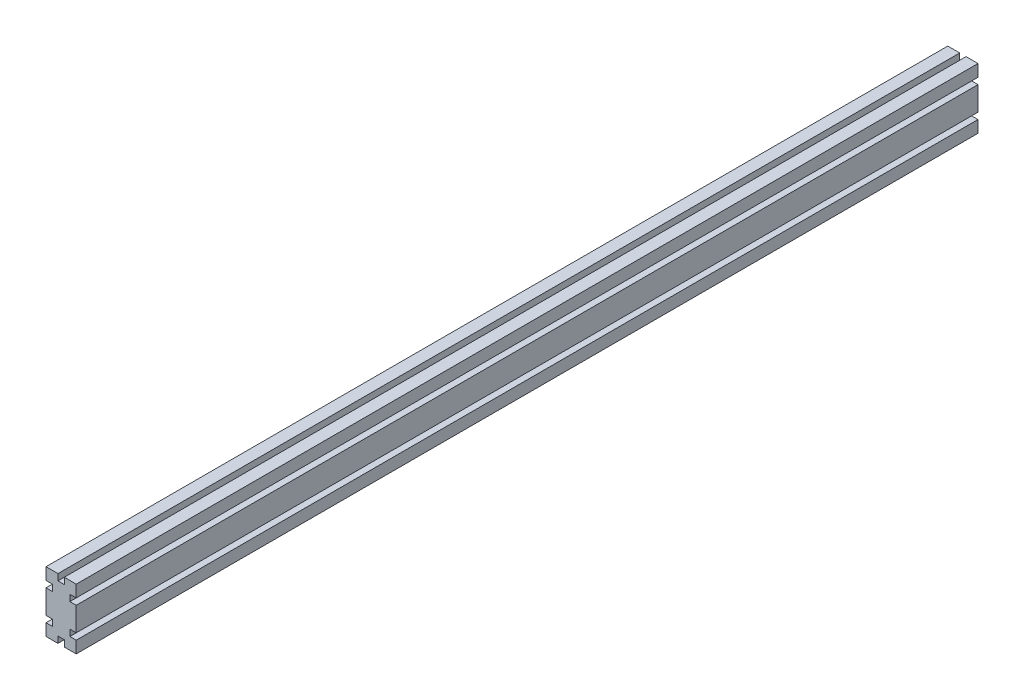
ISO-10303-21;
HEADER;
FILE_DESCRIPTION(('STEP AP214'),'2;1');
FILE_NAME('part.step','',(''),(''),'','','');
FILE_SCHEMA(('AUTOMOTIVE_DESIGN { 1 0 10303 214 1 1 1 1 }'));
ENDSEC;
DATA;
#1=APPLICATION_CONTEXT('core data for automotive mechanical design processes');
#2=APPLICATION_PROTOCOL_DEFINITION('international standard','automotive_design',2000,#1);
#3=PRODUCT_CONTEXT('',#1,'mechanical');
#4=PRODUCT('Part','Part','',(#3));
#5=PRODUCT_RELATED_PRODUCT_CATEGORY('part','',(#4));
#6=PRODUCT_DEFINITION_FORMATION('','',#4);
#7=PRODUCT_DEFINITION_CONTEXT('part definition',#1,'design');
#8=PRODUCT_DEFINITION('design','',#6,#7);
#9=PRODUCT_DEFINITION_SHAPE('','',#8);
#10=(LENGTH_UNIT() NAMED_UNIT(*) SI_UNIT(.MILLI.,.METRE.));
#11=(NAMED_UNIT(*) PLANE_ANGLE_UNIT() SI_UNIT($,.RADIAN.));
#12=(NAMED_UNIT(*) SI_UNIT($,.STERADIAN.) SOLID_ANGLE_UNIT());
#13=UNCERTAINTY_MEASURE_WITH_UNIT(LENGTH_MEASURE(1.E-05),#10,'distance_accuracy_value','');
#14=(GEOMETRIC_REPRESENTATION_CONTEXT(3) GLOBAL_UNCERTAINTY_ASSIGNED_CONTEXT((#13)) GLOBAL_UNIT_ASSIGNED_CONTEXT((#10,
#11,#12)) REPRESENTATION_CONTEXT('',''));
#15=CARTESIAN_POINT('',(0.,0.,0.));
#16=DIRECTION('',(0.,0.,1.));
#17=DIRECTION('',(1.,0.,0.));
#18=AXIS2_PLACEMENT_3D('',#15,#16,#17);
#19=CARTESIAN_POINT('',(-19.05,-23.05,1136.65));
#20=DIRECTION('',(1.,0.,0.));
#21=DIRECTION('',(0.,0.,-1.));
#22=AXIS2_PLACEMENT_3D('',#19,#20,#21);
#23=PLANE('',#22);
#24=DIRECTION('',(0.,-1.,0.));
#25=VECTOR('',#24,1.);
#26=CARTESIAN_POINT('',(-19.05,-23.05,0.));
#27=LINE('',#26,#25);
#28=CARTESIAN_POINT('',(-19.05,-23.05,0.));
#29=VERTEX_POINT('',#28);
#30=CARTESIAN_POINT('',(-19.05,-38.1,0.));
#31=VERTEX_POINT('',#30);
#32=EDGE_CURVE('E255',#29,#31,#27,.T.);
#33=ORIENTED_EDGE('',*,*,#32,.T.);
#34=DIRECTION('',(0.,0.,-1.));
#35=VECTOR('',#34,1.);
#36=CARTESIAN_POINT('',(-19.05,-38.1,1136.65));
#37=LINE('',#36,#35);
#38=CARTESIAN_POINT('',(-19.05,-38.1,1136.65));
#39=VERTEX_POINT('',#38);
#40=EDGE_CURVE('E11',#39,#31,#37,.T.);
#41=ORIENTED_EDGE('',*,*,#40,.F.);
#42=DIRECTION('',(0.,-1.,0.));
#43=VECTOR('',#42,1.);
#44=CARTESIAN_POINT('',(-19.05,-23.05,1136.65));
#45=LINE('',#44,#43);
#46=CARTESIAN_POINT('',(-19.05,-23.05,1136.65));
#47=VERTEX_POINT('',#46);
#48=EDGE_CURVE('E309',#47,#39,#45,.T.);
#49=ORIENTED_EDGE('',*,*,#48,.F.);
#50=DIRECTION('',(0.,0.,-1.));
#51=VECTOR('',#50,1.);
#52=CARTESIAN_POINT('',(-19.05,-23.05,1136.65));
#53=LINE('',#52,#51);
#54=EDGE_CURVE('E251',#47,#29,#53,.T.);
#55=ORIENTED_EDGE('',*,*,#54,.T.);
#56=EDGE_LOOP('',(#33,#41,#49,#55));
#57=FACE_BOUND('',#56,.T.);
#58=ADVANCED_FACE('F39',(#57),#23,.F.);
#59=CARTESIAN_POINT('',(-19.05,-38.1,1136.65));
#60=DIRECTION('',(0.,1.,0.));
#61=DIRECTION('',(0.,0.,1.));
#62=AXIS2_PLACEMENT_3D('',#59,#60,#61);
#63=PLANE('',#62);
#64=DIRECTION('',(1.,0.,0.));
#65=VECTOR('',#64,1.);
#66=CARTESIAN_POINT('',(-19.05,-38.1,0.));
#67=LINE('',#66,#65);
#68=CARTESIAN_POINT('',(-4.,-38.1,0.));
#69=VERTEX_POINT('',#68);
#70=EDGE_CURVE('E258',#31,#69,#67,.T.);
#71=ORIENTED_EDGE('',*,*,#70,.T.);
#72=DIRECTION('',(0.,0.,-1.));
#73=VECTOR('',#72,1.);
#74=CARTESIAN_POINT('',(-4.,-38.1,1136.65));
#75=LINE('',#74,#73);
#76=CARTESIAN_POINT('',(-4.,-38.1,1136.65));
#77=VERTEX_POINT('',#76);
#78=EDGE_CURVE('E47',#77,#69,#75,.T.);
#79=ORIENTED_EDGE('',*,*,#78,.F.);
#80=DIRECTION('',(1.,0.,0.));
#81=VECTOR('',#80,1.);
#82=CARTESIAN_POINT('',(-19.05,-38.1,1136.65));
#83=LINE('',#82,#81);
#84=EDGE_CURVE('E158',#39,#77,#83,.T.);
#85=ORIENTED_EDGE('',*,*,#84,.F.);
#86=ORIENTED_EDGE('',*,*,#40,.T.);
#87=EDGE_LOOP('',(#71,#79,#85,#86));
#88=FACE_BOUND('',#87,.T.);
#89=ADVANCED_FACE('F467',(#88),#63,.F.);
#90=CARTESIAN_POINT('',(-4.,-38.1,1136.65));
#91=DIRECTION('',(-1.,0.,0.));
#92=DIRECTION('',(0.,0.,1.));
#93=AXIS2_PLACEMENT_3D('',#90,#91,#92);
#94=PLANE('',#93);
#95=DIRECTION('',(0.,1.,0.));
#96=VECTOR('',#95,1.);
#97=CARTESIAN_POINT('',(-4.,-38.1,0.));
#98=LINE('',#97,#96);
#99=CARTESIAN_POINT('',(-4.,-30.1,0.));
#100=VERTEX_POINT('',#99);
#101=EDGE_CURVE('E260',#69,#100,#98,.T.);
#102=ORIENTED_EDGE('',*,*,#101,.T.);
#103=DIRECTION('',(0.,0.,-1.));
#104=VECTOR('',#103,1.);
#105=CARTESIAN_POINT('',(-4.,-30.1,1136.65));
#106=LINE('',#105,#104);
#107=CARTESIAN_POINT('',(-4.,-30.1,1136.65));
#108=VERTEX_POINT('',#107);
#109=EDGE_CURVE('E376',#108,#100,#106,.T.);
#110=ORIENTED_EDGE('',*,*,#109,.F.);
#111=DIRECTION('',(0.,1.,0.));
#112=VECTOR('',#111,1.);
#113=CARTESIAN_POINT('',(-4.,-38.1,1136.65));
#114=LINE('',#113,#112);
#115=EDGE_CURVE('E384',#77,#108,#114,.T.);
#116=ORIENTED_EDGE('',*,*,#115,.F.);
#117=ORIENTED_EDGE('',*,*,#78,.T.);
#118=EDGE_LOOP('',(#102,#110,#116,#117));
#119=FACE_BOUND('',#118,.T.);
#120=ADVANCED_FACE('F382',(#119),#94,.F.);
#121=CARTESIAN_POINT('',(-4.,-30.1,1136.65));
#122=DIRECTION('',(0.,1.,0.));
#123=DIRECTION('',(0.,0.,1.));
#124=AXIS2_PLACEMENT_3D('',#121,#122,#123);
#125=PLANE('',#124);
#126=DIRECTION('',(1.,0.,0.));
#127=VECTOR('',#126,1.);
#128=CARTESIAN_POINT('',(-4.,-30.1,0.));
#129=LINE('',#128,#127);
#130=CARTESIAN_POINT('',(4.,-30.1,0.));
#131=VERTEX_POINT('',#130);
#132=EDGE_CURVE('E262',#100,#131,#129,.T.);
#133=ORIENTED_EDGE('',*,*,#132,.T.);
#134=DIRECTION('',(0.,0.,-1.));
#135=VECTOR('',#134,1.);
#136=CARTESIAN_POINT('',(4.,-30.1,1136.65));
#137=LINE('',#136,#135);
#138=CARTESIAN_POINT('',(4.,-30.1,1136.65));
#139=VERTEX_POINT('',#138);
#140=EDGE_CURVE('E373',#139,#131,#137,.T.);
#141=ORIENTED_EDGE('',*,*,#140,.F.);
#142=DIRECTION('',(1.,0.,0.));
#143=VECTOR('',#142,1.);
#144=CARTESIAN_POINT('',(-4.,-30.1,1136.65));
#145=LINE('',#144,#143);
#146=EDGE_CURVE('E402',#108,#139,#145,.T.);
#147=ORIENTED_EDGE('',*,*,#146,.F.);
#148=ORIENTED_EDGE('',*,*,#109,.T.);
#149=EDGE_LOOP('',(#133,#141,#147,#148));
#150=FACE_BOUND('',#149,.T.);
#151=ADVANCED_FACE('F393',(#150),#125,.F.);
#152=CARTESIAN_POINT('',(4.,-30.1,1136.65));
#153=DIRECTION('',(1.,0.,0.));
#154=DIRECTION('',(0.,0.,-1.));
#155=AXIS2_PLACEMENT_3D('',#152,#153,#154);
#156=PLANE('',#155);
#157=DIRECTION('',(0.,-1.,0.));
#158=VECTOR('',#157,1.);
#159=CARTESIAN_POINT('',(4.,-30.1,0.));
#160=LINE('',#159,#158);
#161=CARTESIAN_POINT('',(4.,-38.1,0.));
#162=VERTEX_POINT('',#161);
#163=EDGE_CURVE('E264',#131,#162,#160,.T.);
#164=ORIENTED_EDGE('',*,*,#163,.T.);
#165=DIRECTION('',(0.,0.,-1.));
#166=VECTOR('',#165,1.);
#167=CARTESIAN_POINT('',(4.,-38.1,1136.65));
#168=LINE('',#167,#166);
#169=CARTESIAN_POINT('',(4.,-38.1,1136.65));
#170=VERTEX_POINT('',#169);
#171=EDGE_CURVE('E370',#170,#162,#168,.T.);
#172=ORIENTED_EDGE('',*,*,#171,.F.);
#173=DIRECTION('',(0.,-1.,0.));
#174=VECTOR('',#173,1.);
#175=CARTESIAN_POINT('',(4.,-30.1,1136.65));
#176=LINE('',#175,#174);
#177=EDGE_CURVE('E399',#139,#170,#176,.T.);
#178=ORIENTED_EDGE('',*,*,#177,.F.);
#179=ORIENTED_EDGE('',*,*,#140,.T.);
#180=EDGE_LOOP('',(#164,#172,#178,#179));
#181=FACE_BOUND('',#180,.T.);
#182=ADVANCED_FACE('F397',(#181),#156,.F.);
#183=CARTESIAN_POINT('',(4.,-38.1,1136.65));
#184=DIRECTION('',(0.,1.,0.));
#185=DIRECTION('',(0.,0.,1.));
#186=AXIS2_PLACEMENT_3D('',#183,#184,#185);
#187=PLANE('',#186);
#188=DIRECTION('',(1.,0.,0.));
#189=VECTOR('',#188,1.);
#190=CARTESIAN_POINT('',(4.,-38.1,0.));
#191=LINE('',#190,#189);
#192=CARTESIAN_POINT('',(19.05,-38.1,0.));
#193=VERTEX_POINT('',#192);
#194=EDGE_CURVE('E266',#162,#193,#191,.T.);
#195=ORIENTED_EDGE('',*,*,#194,.T.);
#196=DIRECTION('',(0.,0.,-1.));
#197=VECTOR('',#196,1.);
#198=CARTESIAN_POINT('',(19.05,-38.1,1136.65));
#199=LINE('',#198,#197);
#200=CARTESIAN_POINT('',(19.05,-38.1,1136.65));
#201=VERTEX_POINT('',#200);
#202=EDGE_CURVE('E367',#201,#193,#199,.T.);
#203=ORIENTED_EDGE('',*,*,#202,.F.);
#204=DIRECTION('',(1.,0.,0.));
#205=VECTOR('',#204,1.);
#206=CARTESIAN_POINT('',(4.,-38.1,1136.65));
#207=LINE('',#206,#205);
#208=EDGE_CURVE('E401',#170,#201,#207,.T.);
#209=ORIENTED_EDGE('',*,*,#208,.F.);
#210=ORIENTED_EDGE('',*,*,#171,.T.);
#211=EDGE_LOOP('',(#195,#203,#209,#210));
#212=FACE_BOUND('',#211,.T.);
#213=ADVANCED_FACE('F480',(#212),#187,.F.);
#214=CARTESIAN_POINT('',(19.05,-38.1,1136.65));
#215=DIRECTION('',(-1.,0.,0.));
#216=DIRECTION('',(0.,0.,1.));
#217=AXIS2_PLACEMENT_3D('',#214,#215,#216);
#218=PLANE('',#217);
#219=DIRECTION('',(0.,1.,0.));
#220=VECTOR('',#219,1.);
#221=CARTESIAN_POINT('',(19.05,-38.1,0.));
#222=LINE('',#221,#220);
#223=CARTESIAN_POINT('',(19.05,-23.05,0.));
#224=VERTEX_POINT('',#223);
#225=EDGE_CURVE('E268',#193,#224,#222,.T.);
#226=ORIENTED_EDGE('',*,*,#225,.T.);
#227=DIRECTION('',(0.,0.,-1.));
#228=VECTOR('',#227,1.);
#229=CARTESIAN_POINT('',(19.05,-23.05,1136.65));
#230=LINE('',#229,#228);
#231=CARTESIAN_POINT('',(19.05,-23.05,1136.65));
#232=VERTEX_POINT('',#231);
#233=EDGE_CURVE('E364',#232,#224,#230,.T.);
#234=ORIENTED_EDGE('',*,*,#233,.F.);
#235=DIRECTION('',(0.,1.,0.));
#236=VECTOR('',#235,1.);
#237=CARTESIAN_POINT('',(19.05,-38.1,1136.65));
#238=LINE('',#237,#236);
#239=EDGE_CURVE('E404',#201,#232,#238,.T.);
#240=ORIENTED_EDGE('',*,*,#239,.F.);
#241=ORIENTED_EDGE('',*,*,#202,.T.);
#242=EDGE_LOOP('',(#226,#234,#240,#241));
#243=FACE_BOUND('',#242,.T.);
#244=ADVANCED_FACE('F483',(#243),#218,.F.);
#245=CARTESIAN_POINT('',(19.05,-23.05,1136.65));
#246=DIRECTION('',(0.,-1.,0.));
#247=DIRECTION('',(0.,0.,-1.));
#248=AXIS2_PLACEMENT_3D('',#245,#246,#247);
#249=PLANE('',#248);
#250=DIRECTION('',(-1.,0.,0.));
#251=VECTOR('',#250,1.);
#252=CARTESIAN_POINT('',(19.05,-23.05,0.));
#253=LINE('',#252,#251);
#254=CARTESIAN_POINT('',(11.05,-23.05,0.));
#255=VERTEX_POINT('',#254);
#256=EDGE_CURVE('E270',#224,#255,#253,.T.);
#257=ORIENTED_EDGE('',*,*,#256,.T.);
#258=DIRECTION('',(0.,0.,-1.));
#259=VECTOR('',#258,1.);
#260=CARTESIAN_POINT('',(11.05,-23.05,1136.65));
#261=LINE('',#260,#259);
#262=CARTESIAN_POINT('',(11.05,-23.05,1136.65));
#263=VERTEX_POINT('',#262);
#264=EDGE_CURVE('E361',#263,#255,#261,.T.);
#265=ORIENTED_EDGE('',*,*,#264,.F.);
#266=DIRECTION('',(-1.,0.,0.));
#267=VECTOR('',#266,1.);
#268=CARTESIAN_POINT('',(19.05,-23.05,1136.65));
#269=LINE('',#268,#267);
#270=EDGE_CURVE('E410',#232,#263,#269,.T.);
#271=ORIENTED_EDGE('',*,*,#270,.F.);
#272=ORIENTED_EDGE('',*,*,#233,.T.);
#273=EDGE_LOOP('',(#257,#265,#271,#272));
#274=FACE_BOUND('',#273,.T.);
#275=ADVANCED_FACE('F487',(#274),#249,.F.);
#276=CARTESIAN_POINT('',(11.05,-23.05,1136.65));
#277=DIRECTION('',(-1.,0.,0.));
#278=DIRECTION('',(0.,0.,1.));
#279=AXIS2_PLACEMENT_3D('',#276,#277,#278);
#280=PLANE('',#279);
#281=DIRECTION('',(0.,1.,0.));
#282=VECTOR('',#281,1.);
#283=CARTESIAN_POINT('',(11.05,-23.05,0.));
#284=LINE('',#283,#282);
#285=CARTESIAN_POINT('',(11.05,-15.05,0.));
#286=VERTEX_POINT('',#285);
#287=EDGE_CURVE('E272',#255,#286,#284,.T.);
#288=ORIENTED_EDGE('',*,*,#287,.T.);
#289=DIRECTION('',(0.,0.,-1.));
#290=VECTOR('',#289,1.);
#291=CARTESIAN_POINT('',(11.05,-15.05,1136.65));
#292=LINE('',#291,#290);
#293=CARTESIAN_POINT('',(11.05,-15.05,1136.65));
#294=VERTEX_POINT('',#293);
#295=EDGE_CURVE('E358',#294,#286,#292,.T.);
#296=ORIENTED_EDGE('',*,*,#295,.F.);
#297=DIRECTION('',(0.,1.,0.));
#298=VECTOR('',#297,1.);
#299=CARTESIAN_POINT('',(11.05,-23.05,1136.65));
#300=LINE('',#299,#298);
#301=EDGE_CURVE('E412',#263,#294,#300,.T.);
#302=ORIENTED_EDGE('',*,*,#301,.F.);
#303=ORIENTED_EDGE('',*,*,#264,.T.);
#304=EDGE_LOOP('',(#288,#296,#302,#303));
#305=FACE_BOUND('',#304,.T.);
#306=ADVANCED_FACE('F491',(#305),#280,.F.);
#307=CARTESIAN_POINT('',(11.05,-15.05,1136.65));
#308=DIRECTION('',(0.,1.,0.));
#309=DIRECTION('',(0.,0.,1.));
#310=AXIS2_PLACEMENT_3D('',#307,#308,#309);
#311=PLANE('',#310);
#312=DIRECTION('',(1.,0.,0.));
#313=VECTOR('',#312,1.);
#314=CARTESIAN_POINT('',(11.05,-15.05,0.));
#315=LINE('',#314,#313);
#316=CARTESIAN_POINT('',(19.05,-15.05,0.));
#317=VERTEX_POINT('',#316);
#318=EDGE_CURVE('E274',#286,#317,#315,.T.);
#319=ORIENTED_EDGE('',*,*,#318,.T.);
#320=DIRECTION('',(0.,0.,-1.));
#321=VECTOR('',#320,1.);
#322=CARTESIAN_POINT('',(19.05,-15.05,1136.65));
#323=LINE('',#322,#321);
#324=CARTESIAN_POINT('',(19.05,-15.05,1136.65));
#325=VERTEX_POINT('',#324);
#326=EDGE_CURVE('E355',#325,#317,#323,.T.);
#327=ORIENTED_EDGE('',*,*,#326,.F.);
#328=DIRECTION('',(1.,0.,0.));
#329=VECTOR('',#328,1.);
#330=CARTESIAN_POINT('',(11.05,-15.05,1136.65));
#331=LINE('',#330,#329);
#332=EDGE_CURVE('E414',#294,#325,#331,.T.);
#333=ORIENTED_EDGE('',*,*,#332,.F.);
#334=ORIENTED_EDGE('',*,*,#295,.T.);
#335=EDGE_LOOP('',(#319,#327,#333,#334));
#336=FACE_BOUND('',#335,.T.);
#337=ADVANCED_FACE('F495',(#336),#311,.F.);
#338=CARTESIAN_POINT('',(19.05,-15.05,1136.65));
#339=DIRECTION('',(-1.,0.,0.));
#340=DIRECTION('',(0.,0.,1.));
#341=AXIS2_PLACEMENT_3D('',#338,#339,#340);
#342=PLANE('',#341);
#343=DIRECTION('',(0.,1.,0.));
#344=VECTOR('',#343,1.);
#345=CARTESIAN_POINT('',(19.05,-15.05,0.));
#346=LINE('',#345,#344);
#347=CARTESIAN_POINT('',(19.05,15.05,0.));
#348=VERTEX_POINT('',#347);
#349=EDGE_CURVE('E276',#317,#348,#346,.T.);
#350=ORIENTED_EDGE('',*,*,#349,.T.);
#351=DIRECTION('',(0.,0.,-1.));
#352=VECTOR('',#351,1.);
#353=CARTESIAN_POINT('',(19.05,15.05,1136.65));
#354=LINE('',#353,#352);
#355=CARTESIAN_POINT('',(19.05,15.05,1136.65));
#356=VERTEX_POINT('',#355);
#357=EDGE_CURVE('E352',#356,#348,#354,.T.);
#358=ORIENTED_EDGE('',*,*,#357,.F.);
#359=DIRECTION('',(0.,1.,0.));
#360=VECTOR('',#359,1.);
#361=CARTESIAN_POINT('',(19.05,-15.05,1136.65));
#362=LINE('',#361,#360);
#363=EDGE_CURVE('E416',#325,#356,#362,.T.);
#364=ORIENTED_EDGE('',*,*,#363,.F.);
#365=ORIENTED_EDGE('',*,*,#326,.T.);
#366=EDGE_LOOP('',(#350,#358,#364,#365));
#367=FACE_BOUND('',#366,.T.);
#368=ADVANCED_FACE('F499',(#367),#342,.F.);
#369=CARTESIAN_POINT('',(19.05,15.05,1136.65));
#370=DIRECTION('',(0.,-1.,0.));
#371=DIRECTION('',(0.,0.,-1.));
#372=AXIS2_PLACEMENT_3D('',#369,#370,#371);
#373=PLANE('',#372);
#374=DIRECTION('',(-1.,0.,0.));
#375=VECTOR('',#374,1.);
#376=CARTESIAN_POINT('',(19.05,15.05,0.));
#377=LINE('',#376,#375);
#378=CARTESIAN_POINT('',(11.05,15.05,0.));
#379=VERTEX_POINT('',#378);
#380=EDGE_CURVE('E278',#348,#379,#377,.T.);
#381=ORIENTED_EDGE('',*,*,#380,.T.);
#382=DIRECTION('',(0.,0.,-1.));
#383=VECTOR('',#382,1.);
#384=CARTESIAN_POINT('',(11.05,15.05,1136.65));
#385=LINE('',#384,#383);
#386=CARTESIAN_POINT('',(11.05,15.05,1136.65));
#387=VERTEX_POINT('',#386);
#388=EDGE_CURVE('E349',#387,#379,#385,.T.);
#389=ORIENTED_EDGE('',*,*,#388,.F.);
#390=DIRECTION('',(-1.,0.,0.));
#391=VECTOR('',#390,1.);
#392=CARTESIAN_POINT('',(19.05,15.05,1136.65));
#393=LINE('',#392,#391);
#394=EDGE_CURVE('E418',#356,#387,#393,.T.);
#395=ORIENTED_EDGE('',*,*,#394,.F.);
#396=ORIENTED_EDGE('',*,*,#357,.T.);
#397=EDGE_LOOP('',(#381,#389,#395,#396));
#398=FACE_BOUND('',#397,.T.);
#399=ADVANCED_FACE('F503',(#398),#373,.F.);
#400=CARTESIAN_POINT('',(11.05,15.05,1136.65));
#401=DIRECTION('',(-1.,0.,0.));
#402=DIRECTION('',(0.,0.,1.));
#403=AXIS2_PLACEMENT_3D('',#400,#401,#402);
#404=PLANE('',#403);
#405=DIRECTION('',(0.,1.,0.));
#406=VECTOR('',#405,1.);
#407=CARTESIAN_POINT('',(11.05,15.05,0.));
#408=LINE('',#407,#406);
#409=CARTESIAN_POINT('',(11.05,23.05,0.));
#410=VERTEX_POINT('',#409);
#411=EDGE_CURVE('E280',#379,#410,#408,.T.);
#412=ORIENTED_EDGE('',*,*,#411,.T.);
#413=DIRECTION('',(0.,0.,-1.));
#414=VECTOR('',#413,1.);
#415=CARTESIAN_POINT('',(11.05,23.05,1136.65));
#416=LINE('',#415,#414);
#417=CARTESIAN_POINT('',(11.05,23.05,1136.65));
#418=VERTEX_POINT('',#417);
#419=EDGE_CURVE('E346',#418,#410,#416,.T.);
#420=ORIENTED_EDGE('',*,*,#419,.F.);
#421=DIRECTION('',(0.,1.,0.));
#422=VECTOR('',#421,1.);
#423=CARTESIAN_POINT('',(11.05,15.05,1136.65));
#424=LINE('',#423,#422);
#425=EDGE_CURVE('E420',#387,#418,#424,.T.);
#426=ORIENTED_EDGE('',*,*,#425,.F.);
#427=ORIENTED_EDGE('',*,*,#388,.T.);
#428=EDGE_LOOP('',(#412,#420,#426,#427));
#429=FACE_BOUND('',#428,.T.);
#430=ADVANCED_FACE('F507',(#429),#404,.F.);
#431=CARTESIAN_POINT('',(11.05,23.05,1136.65));
#432=DIRECTION('',(0.,1.,0.));
#433=DIRECTION('',(0.,0.,1.));
#434=AXIS2_PLACEMENT_3D('',#431,#432,#433);
#435=PLANE('',#434);
#436=DIRECTION('',(1.,0.,0.));
#437=VECTOR('',#436,1.);
#438=CARTESIAN_POINT('',(11.05,23.05,0.));
#439=LINE('',#438,#437);
#440=CARTESIAN_POINT('',(19.05,23.05,0.));
#441=VERTEX_POINT('',#440);
#442=EDGE_CURVE('E282',#410,#441,#439,.T.);
#443=ORIENTED_EDGE('',*,*,#442,.T.);
#444=DIRECTION('',(0.,0.,-1.));
#445=VECTOR('',#444,1.);
#446=CARTESIAN_POINT('',(19.05,23.05,1136.65));
#447=LINE('',#446,#445);
#448=CARTESIAN_POINT('',(19.05,23.05,1136.65));
#449=VERTEX_POINT('',#448);
#450=EDGE_CURVE('E343',#449,#441,#447,.T.);
#451=ORIENTED_EDGE('',*,*,#450,.F.);
#452=DIRECTION('',(1.,0.,0.));
#453=VECTOR('',#452,1.);
#454=CARTESIAN_POINT('',(11.05,23.05,1136.65));
#455=LINE('',#454,#453);
#456=EDGE_CURVE('E422',#418,#449,#455,.T.);
#457=ORIENTED_EDGE('',*,*,#456,.F.);
#458=ORIENTED_EDGE('',*,*,#419,.T.);
#459=EDGE_LOOP('',(#443,#451,#457,#458));
#460=FACE_BOUND('',#459,.T.);
#461=ADVANCED_FACE('F511',(#460),#435,.F.);
#462=CARTESIAN_POINT('',(19.05,23.05,1136.65));
#463=DIRECTION('',(-1.,0.,0.));
#464=DIRECTION('',(0.,0.,1.));
#465=AXIS2_PLACEMENT_3D('',#462,#463,#464);
#466=PLANE('',#465);
#467=DIRECTION('',(0.,1.,0.));
#468=VECTOR('',#467,1.);
#469=CARTESIAN_POINT('',(19.05,23.05,0.));
#470=LINE('',#469,#468);
#471=CARTESIAN_POINT('',(19.05,38.1,0.));
#472=VERTEX_POINT('',#471);
#473=EDGE_CURVE('E284',#441,#472,#470,.T.);
#474=ORIENTED_EDGE('',*,*,#473,.T.);
#475=DIRECTION('',(0.,0.,-1.));
#476=VECTOR('',#475,1.);
#477=CARTESIAN_POINT('',(19.05,38.1,1136.65));
#478=LINE('',#477,#476);
#479=CARTESIAN_POINT('',(19.05,38.1,1136.65));
#480=VERTEX_POINT('',#479);
#481=EDGE_CURVE('E340',#480,#472,#478,.T.);
#482=ORIENTED_EDGE('',*,*,#481,.F.);
#483=DIRECTION('',(0.,1.,0.));
#484=VECTOR('',#483,1.);
#485=CARTESIAN_POINT('',(19.05,23.05,1136.65));
#486=LINE('',#485,#484);
#487=EDGE_CURVE('E424',#449,#480,#486,.T.);
#488=ORIENTED_EDGE('',*,*,#487,.F.);
#489=ORIENTED_EDGE('',*,*,#450,.T.);
#490=EDGE_LOOP('',(#474,#482,#488,#489));
#491=FACE_BOUND('',#490,.T.);
#492=ADVANCED_FACE('F515',(#491),#466,.F.);
#493=CARTESIAN_POINT('',(19.05,38.1,1136.65));
#494=DIRECTION('',(0.,-1.,0.));
#495=DIRECTION('',(0.,0.,-1.));
#496=AXIS2_PLACEMENT_3D('',#493,#494,#495);
#497=PLANE('',#496);
#498=DIRECTION('',(-1.,0.,0.));
#499=VECTOR('',#498,1.);
#500=CARTESIAN_POINT('',(19.05,38.1,0.));
#501=LINE('',#500,#499);
#502=CARTESIAN_POINT('',(4.,38.1,0.));
#503=VERTEX_POINT('',#502);
#504=EDGE_CURVE('E286',#472,#503,#501,.T.);
#505=ORIENTED_EDGE('',*,*,#504,.T.);
#506=DIRECTION('',(0.,0.,-1.));
#507=VECTOR('',#506,1.);
#508=CARTESIAN_POINT('',(4.,38.1,1136.65));
#509=LINE('',#508,#507);
#510=CARTESIAN_POINT('',(4.,38.1,1136.65));
#511=VERTEX_POINT('',#510);
#512=EDGE_CURVE('E337',#511,#503,#509,.T.);
#513=ORIENTED_EDGE('',*,*,#512,.F.);
#514=DIRECTION('',(-1.,0.,0.));
#515=VECTOR('',#514,1.);
#516=CARTESIAN_POINT('',(19.05,38.1,1136.65));
#517=LINE('',#516,#515);
#518=EDGE_CURVE('E426',#480,#511,#517,.T.);
#519=ORIENTED_EDGE('',*,*,#518,.F.);
#520=ORIENTED_EDGE('',*,*,#481,.T.);
#521=EDGE_LOOP('',(#505,#513,#519,#520));
#522=FACE_BOUND('',#521,.T.);
#523=ADVANCED_FACE('F519',(#522),#497,.F.);
#524=CARTESIAN_POINT('',(4.,38.1,1136.65));
#525=DIRECTION('',(1.,0.,0.));
#526=DIRECTION('',(0.,0.,-1.));
#527=AXIS2_PLACEMENT_3D('',#524,#525,#526);
#528=PLANE('',#527);
#529=DIRECTION('',(0.,-1.,0.));
#530=VECTOR('',#529,1.);
#531=CARTESIAN_POINT('',(4.,38.1,0.));
#532=LINE('',#531,#530);
#533=CARTESIAN_POINT('',(4.,30.1,0.));
#534=VERTEX_POINT('',#533);
#535=EDGE_CURVE('E288',#503,#534,#532,.T.);
#536=ORIENTED_EDGE('',*,*,#535,.T.);
#537=DIRECTION('',(0.,0.,-1.));
#538=VECTOR('',#537,1.);
#539=CARTESIAN_POINT('',(4.,30.1,1136.65));
#540=LINE('',#539,#538);
#541=CARTESIAN_POINT('',(4.,30.1,1136.65));
#542=VERTEX_POINT('',#541);
#543=EDGE_CURVE('E334',#542,#534,#540,.T.);
#544=ORIENTED_EDGE('',*,*,#543,.F.);
#545=DIRECTION('',(0.,-1.,0.));
#546=VECTOR('',#545,1.);
#547=CARTESIAN_POINT('',(4.,38.1,1136.65));
#548=LINE('',#547,#546);
#549=EDGE_CURVE('E428',#511,#542,#548,.T.);
#550=ORIENTED_EDGE('',*,*,#549,.F.);
#551=ORIENTED_EDGE('',*,*,#512,.T.);
#552=EDGE_LOOP('',(#536,#544,#550,#551));
#553=FACE_BOUND('',#552,.T.);
#554=ADVANCED_FACE('F523',(#553),#528,.F.);
#555=CARTESIAN_POINT('',(4.,30.1,1136.65));
#556=DIRECTION('',(0.,-1.,0.));
#557=DIRECTION('',(0.,0.,-1.));
#558=AXIS2_PLACEMENT_3D('',#555,#556,#557);
#559=PLANE('',#558);
#560=DIRECTION('',(-1.,0.,0.));
#561=VECTOR('',#560,1.);
#562=CARTESIAN_POINT('',(4.,30.1,0.));
#563=LINE('',#562,#561);
#564=CARTESIAN_POINT('',(-4.,30.1,0.));
#565=VERTEX_POINT('',#564);
#566=EDGE_CURVE('E290',#534,#565,#563,.T.);
#567=ORIENTED_EDGE('',*,*,#566,.T.);
#568=DIRECTION('',(0.,0.,-1.));
#569=VECTOR('',#568,1.);
#570=CARTESIAN_POINT('',(-4.,30.1,1136.65));
#571=LINE('',#570,#569);
#572=CARTESIAN_POINT('',(-4.,30.1,1136.65));
#573=VERTEX_POINT('',#572);
#574=EDGE_CURVE('E331',#573,#565,#571,.T.);
#575=ORIENTED_EDGE('',*,*,#574,.F.);
#576=DIRECTION('',(-1.,0.,0.));
#577=VECTOR('',#576,1.);
#578=CARTESIAN_POINT('',(4.,30.1,1136.65));
#579=LINE('',#578,#577);
#580=EDGE_CURVE('E430',#542,#573,#579,.T.);
#581=ORIENTED_EDGE('',*,*,#580,.F.);
#582=ORIENTED_EDGE('',*,*,#543,.T.);
#583=EDGE_LOOP('',(#567,#575,#581,#582));
#584=FACE_BOUND('',#583,.T.);
#585=ADVANCED_FACE('F527',(#584),#559,.F.);
#586=CARTESIAN_POINT('',(-4.,30.1,1136.65));
#587=DIRECTION('',(-1.,0.,0.));
#588=DIRECTION('',(0.,0.,1.));
#589=AXIS2_PLACEMENT_3D('',#586,#587,#588);
#590=PLANE('',#589);
#591=DIRECTION('',(0.,1.,0.));
#592=VECTOR('',#591,1.);
#593=CARTESIAN_POINT('',(-4.,30.1,0.));
#594=LINE('',#593,#592);
#595=CARTESIAN_POINT('',(-4.,38.1,0.));
#596=VERTEX_POINT('',#595);
#597=EDGE_CURVE('E292',#565,#596,#594,.T.);
#598=ORIENTED_EDGE('',*,*,#597,.T.);
#599=DIRECTION('',(0.,0.,-1.));
#600=VECTOR('',#599,1.);
#601=CARTESIAN_POINT('',(-4.,38.1,1136.65));
#602=LINE('',#601,#600);
#603=CARTESIAN_POINT('',(-4.,38.1,1136.65));
#604=VERTEX_POINT('',#603);
#605=EDGE_CURVE('E328',#604,#596,#602,.T.);
#606=ORIENTED_EDGE('',*,*,#605,.F.);
#607=DIRECTION('',(0.,1.,0.));
#608=VECTOR('',#607,1.);
#609=CARTESIAN_POINT('',(-4.,30.1,1136.65));
#610=LINE('',#609,#608);
#611=EDGE_CURVE('E432',#573,#604,#610,.T.);
#612=ORIENTED_EDGE('',*,*,#611,.F.);
#613=ORIENTED_EDGE('',*,*,#574,.T.);
#614=EDGE_LOOP('',(#598,#606,#612,#613));
#615=FACE_BOUND('',#614,.T.);
#616=ADVANCED_FACE('F531',(#615),#590,.F.);
#617=CARTESIAN_POINT('',(-4.,38.1,1136.65));
#618=DIRECTION('',(0.,-1.,0.));
#619=DIRECTION('',(0.,0.,-1.));
#620=AXIS2_PLACEMENT_3D('',#617,#618,#619);
#621=PLANE('',#620);
#622=DIRECTION('',(-1.,0.,0.));
#623=VECTOR('',#622,1.);
#624=CARTESIAN_POINT('',(-4.,38.1,0.));
#625=LINE('',#624,#623);
#626=CARTESIAN_POINT('',(-19.05,38.1,0.));
#627=VERTEX_POINT('',#626);
#628=EDGE_CURVE('E294',#596,#627,#625,.T.);
#629=ORIENTED_EDGE('',*,*,#628,.T.);
#630=DIRECTION('',(0.,0.,-1.));
#631=VECTOR('',#630,1.);
#632=CARTESIAN_POINT('',(-19.05,38.1,1136.65));
#633=LINE('',#632,#631);
#634=CARTESIAN_POINT('',(-19.05,38.1,1136.65));
#635=VERTEX_POINT('',#634);
#636=EDGE_CURVE('E325',#635,#627,#633,.T.);
#637=ORIENTED_EDGE('',*,*,#636,.F.);
#638=DIRECTION('',(-1.,0.,0.));
#639=VECTOR('',#638,1.);
#640=CARTESIAN_POINT('',(-4.,38.1,1136.65));
#641=LINE('',#640,#639);
#642=EDGE_CURVE('E434',#604,#635,#641,.T.);
#643=ORIENTED_EDGE('',*,*,#642,.F.);
#644=ORIENTED_EDGE('',*,*,#605,.T.);
#645=EDGE_LOOP('',(#629,#637,#643,#644));
#646=FACE_BOUND('',#645,.T.);
#647=ADVANCED_FACE('F535',(#646),#621,.F.);
#648=CARTESIAN_POINT('',(-19.05,38.1,1136.65));
#649=DIRECTION('',(1.,0.,0.));
#650=DIRECTION('',(0.,0.,-1.));
#651=AXIS2_PLACEMENT_3D('',#648,#649,#650);
#652=PLANE('',#651);
#653=DIRECTION('',(0.,-1.,0.));
#654=VECTOR('',#653,1.);
#655=CARTESIAN_POINT('',(-19.05,38.1,0.));
#656=LINE('',#655,#654);
#657=CARTESIAN_POINT('',(-19.05,23.05,0.));
#658=VERTEX_POINT('',#657);
#659=EDGE_CURVE('E296',#627,#658,#656,.T.);
#660=ORIENTED_EDGE('',*,*,#659,.T.);
#661=DIRECTION('',(0.,0.,-1.));
#662=VECTOR('',#661,1.);
#663=CARTESIAN_POINT('',(-19.05,23.05,1136.65));
#664=LINE('',#663,#662);
#665=CARTESIAN_POINT('',(-19.05,23.05,1136.65));
#666=VERTEX_POINT('',#665);
#667=EDGE_CURVE('E322',#666,#658,#664,.T.);
#668=ORIENTED_EDGE('',*,*,#667,.F.);
#669=DIRECTION('',(0.,-1.,0.));
#670=VECTOR('',#669,1.);
#671=CARTESIAN_POINT('',(-19.05,38.1,1136.65));
#672=LINE('',#671,#670);
#673=EDGE_CURVE('E436',#635,#666,#672,.T.);
#674=ORIENTED_EDGE('',*,*,#673,.F.);
#675=ORIENTED_EDGE('',*,*,#636,.T.);
#676=EDGE_LOOP('',(#660,#668,#674,#675));
#677=FACE_BOUND('',#676,.T.);
#678=ADVANCED_FACE('F539',(#677),#652,.F.);
#679=CARTESIAN_POINT('',(-19.05,23.05,1136.65));
#680=DIRECTION('',(0.,1.,0.));
#681=DIRECTION('',(0.,0.,1.));
#682=AXIS2_PLACEMENT_3D('',#679,#680,#681);
#683=PLANE('',#682);
#684=DIRECTION('',(1.,0.,0.));
#685=VECTOR('',#684,1.);
#686=CARTESIAN_POINT('',(-19.05,23.05,0.));
#687=LINE('',#686,#685);
#688=CARTESIAN_POINT('',(-11.05,23.05,0.));
#689=VERTEX_POINT('',#688);
#690=EDGE_CURVE('E298',#658,#689,#687,.T.);
#691=ORIENTED_EDGE('',*,*,#690,.T.);
#692=DIRECTION('',(0.,0.,-1.));
#693=VECTOR('',#692,1.);
#694=CARTESIAN_POINT('',(-11.05,23.05,1136.65));
#695=LINE('',#694,#693);
#696=CARTESIAN_POINT('',(-11.05,23.05,1136.65));
#697=VERTEX_POINT('',#696);
#698=EDGE_CURVE('E319',#697,#689,#695,.T.);
#699=ORIENTED_EDGE('',*,*,#698,.F.);
#700=DIRECTION('',(1.,0.,0.));
#701=VECTOR('',#700,1.);
#702=CARTESIAN_POINT('',(-19.05,23.05,1136.65));
#703=LINE('',#702,#701);
#704=EDGE_CURVE('E438',#666,#697,#703,.T.);
#705=ORIENTED_EDGE('',*,*,#704,.F.);
#706=ORIENTED_EDGE('',*,*,#667,.T.);
#707=EDGE_LOOP('',(#691,#699,#705,#706));
#708=FACE_BOUND('',#707,.T.);
#709=ADVANCED_FACE('F543',(#708),#683,.F.);
#710=CARTESIAN_POINT('',(-11.05,23.05,1136.65));
#711=DIRECTION('',(1.,0.,0.));
#712=DIRECTION('',(0.,0.,-1.));
#713=AXIS2_PLACEMENT_3D('',#710,#711,#712);
#714=PLANE('',#713);
#715=DIRECTION('',(0.,-1.,0.));
#716=VECTOR('',#715,1.);
#717=CARTESIAN_POINT('',(-11.05,23.05,0.));
#718=LINE('',#717,#716);
#719=CARTESIAN_POINT('',(-11.05,15.05,0.));
#720=VERTEX_POINT('',#719);
#721=EDGE_CURVE('E300',#689,#720,#718,.T.);
#722=ORIENTED_EDGE('',*,*,#721,.T.);
#723=DIRECTION('',(0.,0.,-1.));
#724=VECTOR('',#723,1.);
#725=CARTESIAN_POINT('',(-11.05,15.05,1136.65));
#726=LINE('',#725,#724);
#727=CARTESIAN_POINT('',(-11.05,15.05,1136.65));
#728=VERTEX_POINT('',#727);
#729=EDGE_CURVE('E316',#728,#720,#726,.T.);
#730=ORIENTED_EDGE('',*,*,#729,.F.);
#731=DIRECTION('',(0.,-1.,0.));
#732=VECTOR('',#731,1.);
#733=CARTESIAN_POINT('',(-11.05,23.05,1136.65));
#734=LINE('',#733,#732);
#735=EDGE_CURVE('E440',#697,#728,#734,.T.);
#736=ORIENTED_EDGE('',*,*,#735,.F.);
#737=ORIENTED_EDGE('',*,*,#698,.T.);
#738=EDGE_LOOP('',(#722,#730,#736,#737));
#739=FACE_BOUND('',#738,.T.);
#740=ADVANCED_FACE('F547',(#739),#714,.F.);
#741=CARTESIAN_POINT('',(-11.05,15.05,1136.65));
#742=DIRECTION('',(0.,-1.,0.));
#743=DIRECTION('',(0.,0.,-1.));
#744=AXIS2_PLACEMENT_3D('',#741,#742,#743);
#745=PLANE('',#744);
#746=DIRECTION('',(-1.,0.,0.));
#747=VECTOR('',#746,1.);
#748=CARTESIAN_POINT('',(-11.05,15.05,0.));
#749=LINE('',#748,#747);
#750=CARTESIAN_POINT('',(-19.05,15.05,0.));
#751=VERTEX_POINT('',#750);
#752=EDGE_CURVE('E302',#720,#751,#749,.T.);
#753=ORIENTED_EDGE('',*,*,#752,.T.);
#754=DIRECTION('',(0.,0.,-1.));
#755=VECTOR('',#754,1.);
#756=CARTESIAN_POINT('',(-19.05,15.05,1136.65));
#757=LINE('',#756,#755);
#758=CARTESIAN_POINT('',(-19.05,15.05,1136.65));
#759=VERTEX_POINT('',#758);
#760=EDGE_CURVE('E313',#759,#751,#757,.T.);
#761=ORIENTED_EDGE('',*,*,#760,.F.);
#762=DIRECTION('',(-1.,0.,0.));
#763=VECTOR('',#762,1.);
#764=CARTESIAN_POINT('',(-11.05,15.05,1136.65));
#765=LINE('',#764,#763);
#766=EDGE_CURVE('E442',#728,#759,#765,.T.);
#767=ORIENTED_EDGE('',*,*,#766,.F.);
#768=ORIENTED_EDGE('',*,*,#729,.T.);
#769=EDGE_LOOP('',(#753,#761,#767,#768));
#770=FACE_BOUND('',#769,.T.);
#771=ADVANCED_FACE('F448',(#770),#745,.F.);
#772=CARTESIAN_POINT('',(-19.05,15.05,1136.65));
#773=DIRECTION('',(1.,0.,0.));
#774=DIRECTION('',(0.,0.,-1.));
#775=AXIS2_PLACEMENT_3D('',#772,#773,#774);
#776=PLANE('',#775);
#777=DIRECTION('',(0.,-1.,0.));
#778=VECTOR('',#777,1.);
#779=CARTESIAN_POINT('',(-19.05,15.05,0.));
#780=LINE('',#779,#778);
#781=CARTESIAN_POINT('',(-19.05,-15.05,0.));
#782=VERTEX_POINT('',#781);
#783=EDGE_CURVE('E304',#751,#782,#780,.T.);
#784=ORIENTED_EDGE('',*,*,#783,.T.);
#785=DIRECTION('',(0.,0.,-1.));
#786=VECTOR('',#785,1.);
#787=CARTESIAN_POINT('',(-19.05,-15.05,1136.65));
#788=LINE('',#787,#786);
#789=CARTESIAN_POINT('',(-19.05,-15.05,1136.65));
#790=VERTEX_POINT('',#789);
#791=EDGE_CURVE('E246',#790,#782,#788,.T.);
#792=ORIENTED_EDGE('',*,*,#791,.F.);
#793=DIRECTION('',(0.,-1.,0.));
#794=VECTOR('',#793,1.);
#795=CARTESIAN_POINT('',(-19.05,15.05,1136.65));
#796=LINE('',#795,#794);
#797=EDGE_CURVE('E237',#759,#790,#796,.T.);
#798=ORIENTED_EDGE('',*,*,#797,.F.);
#799=ORIENTED_EDGE('',*,*,#760,.T.);
#800=EDGE_LOOP('',(#784,#792,#798,#799));
#801=FACE_BOUND('',#800,.T.);
#802=ADVANCED_FACE('F452',(#801),#776,.F.);
#803=CARTESIAN_POINT('',(-19.05,-15.05,1136.65));
#804=DIRECTION('',(0.,1.,0.));
#805=DIRECTION('',(0.,0.,1.));
#806=AXIS2_PLACEMENT_3D('',#803,#804,#805);
#807=PLANE('',#806);
#808=DIRECTION('',(1.,0.,0.));
#809=VECTOR('',#808,1.);
#810=CARTESIAN_POINT('',(-19.05,-15.05,0.));
#811=LINE('',#810,#809);
#812=CARTESIAN_POINT('',(-11.05,-15.05,0.));
#813=VERTEX_POINT('',#812);
#814=EDGE_CURVE('E245',#782,#813,#811,.T.);
#815=ORIENTED_EDGE('',*,*,#814,.T.);
#816=DIRECTION('',(0.,0.,-1.));
#817=VECTOR('',#816,1.);
#818=CARTESIAN_POINT('',(-11.05,-15.05,1136.65));
#819=LINE('',#818,#817);
#820=CARTESIAN_POINT('',(-11.05,-15.05,1136.65));
#821=VERTEX_POINT('',#820);
#822=EDGE_CURVE('E242',#821,#813,#819,.T.);
#823=ORIENTED_EDGE('',*,*,#822,.F.);
#824=DIRECTION('',(1.,0.,0.));
#825=VECTOR('',#824,1.);
#826=CARTESIAN_POINT('',(-19.05,-15.05,1136.65));
#827=LINE('',#826,#825);
#828=EDGE_CURVE('E231',#790,#821,#827,.T.);
#829=ORIENTED_EDGE('',*,*,#828,.F.);
#830=ORIENTED_EDGE('',*,*,#791,.T.);
#831=EDGE_LOOP('',(#815,#823,#829,#830));
#832=FACE_BOUND('',#831,.T.);
#833=ADVANCED_FACE('F243',(#832),#807,.F.);
#834=CARTESIAN_POINT('',(-11.05,-15.05,1136.65));
#835=DIRECTION('',(1.,0.,0.));
#836=DIRECTION('',(0.,0.,-1.));
#837=AXIS2_PLACEMENT_3D('',#834,#835,#836);
#838=PLANE('',#837);
#839=DIRECTION('',(0.,-1.,0.));
#840=VECTOR('',#839,1.);
#841=CARTESIAN_POINT('',(-11.05,-15.05,0.));
#842=LINE('',#841,#840);
#843=CARTESIAN_POINT('',(-11.05,-23.05,0.));
#844=VERTEX_POINT('',#843);
#845=EDGE_CURVE('E144',#813,#844,#842,.T.);
#846=ORIENTED_EDGE('',*,*,#845,.T.);
#847=DIRECTION('',(0.,0.,-1.));
#848=VECTOR('',#847,1.);
#849=CARTESIAN_POINT('',(-11.05,-23.05,1136.65));
#850=LINE('',#849,#848);
#851=CARTESIAN_POINT('',(-11.05,-23.05,1136.65));
#852=VERTEX_POINT('',#851);
#853=EDGE_CURVE('E247',#852,#844,#850,.T.);
#854=ORIENTED_EDGE('',*,*,#853,.F.);
#855=DIRECTION('',(0.,-1.,0.));
#856=VECTOR('',#855,1.);
#857=CARTESIAN_POINT('',(-11.05,-15.05,1136.65));
#858=LINE('',#857,#856);
#859=EDGE_CURVE('E235',#821,#852,#858,.T.);
#860=ORIENTED_EDGE('',*,*,#859,.F.);
#861=ORIENTED_EDGE('',*,*,#822,.T.);
#862=EDGE_LOOP('',(#846,#854,#860,#861));
#863=FACE_BOUND('',#862,.T.);
#864=ADVANCED_FACE('F249',(#863),#838,.F.);
#865=CARTESIAN_POINT('',(-11.05,-23.05,1136.65));
#866=DIRECTION('',(0.,-1.,0.));
#867=DIRECTION('',(0.,0.,-1.));
#868=AXIS2_PLACEMENT_3D('',#865,#866,#867);
#869=PLANE('',#868);
#870=DIRECTION('',(-1.,0.,0.));
#871=VECTOR('',#870,1.);
#872=CARTESIAN_POINT('',(-11.05,-23.05,0.));
#873=LINE('',#872,#871);
#874=EDGE_CURVE('E150',#844,#29,#873,.T.);
#875=ORIENTED_EDGE('',*,*,#874,.T.);
#876=ORIENTED_EDGE('',*,*,#54,.F.);
#877=DIRECTION('',(-1.,0.,0.));
#878=VECTOR('',#877,1.);
#879=CARTESIAN_POINT('',(-11.05,-23.05,1136.65));
#880=LINE('',#879,#878);
#881=EDGE_CURVE('E55',#852,#47,#880,.T.);
#882=ORIENTED_EDGE('',*,*,#881,.F.);
#883=ORIENTED_EDGE('',*,*,#853,.T.);
#884=EDGE_LOOP('',(#875,#876,#882,#883));
#885=FACE_BOUND('',#884,.T.);
#886=ADVANCED_FACE('F456',(#885),#869,.F.);
#887=CARTESIAN_POINT('',(0.,0.,1136.65));
#888=DIRECTION('',(0.,0.,1.));
#889=DIRECTION('',(1.,0.,0.));
#890=AXIS2_PLACEMENT_3D('',#887,#888,#889);
#891=PLANE('',#890);
#892=ORIENTED_EDGE('',*,*,#48,.T.);
#893=ORIENTED_EDGE('',*,*,#84,.T.);
#894=ORIENTED_EDGE('',*,*,#115,.T.);
#895=ORIENTED_EDGE('',*,*,#146,.T.);
#896=ORIENTED_EDGE('',*,*,#177,.T.);
#897=ORIENTED_EDGE('',*,*,#208,.T.);
#898=ORIENTED_EDGE('',*,*,#239,.T.);
#899=ORIENTED_EDGE('',*,*,#270,.T.);
#900=ORIENTED_EDGE('',*,*,#301,.T.);
#901=ORIENTED_EDGE('',*,*,#332,.T.);
#902=ORIENTED_EDGE('',*,*,#363,.T.);
#903=ORIENTED_EDGE('',*,*,#394,.T.);
#904=ORIENTED_EDGE('',*,*,#425,.T.);
#905=ORIENTED_EDGE('',*,*,#456,.T.);
#906=ORIENTED_EDGE('',*,*,#487,.T.);
#907=ORIENTED_EDGE('',*,*,#518,.T.);
#908=ORIENTED_EDGE('',*,*,#549,.T.);
#909=ORIENTED_EDGE('',*,*,#580,.T.);
#910=ORIENTED_EDGE('',*,*,#611,.T.);
#911=ORIENTED_EDGE('',*,*,#642,.T.);
#912=ORIENTED_EDGE('',*,*,#673,.T.);
#913=ORIENTED_EDGE('',*,*,#704,.T.);
#914=ORIENTED_EDGE('',*,*,#735,.T.);
#915=ORIENTED_EDGE('',*,*,#766,.T.);
#916=ORIENTED_EDGE('',*,*,#797,.T.);
#917=ORIENTED_EDGE('',*,*,#828,.T.);
#918=ORIENTED_EDGE('',*,*,#859,.T.);
#919=ORIENTED_EDGE('',*,*,#881,.T.);
#920=EDGE_LOOP('',(#892,#893,#894,#895,#896,#897,#898,#899,#900,#901,#902,#903,#904,#905,#906,
#907,#908,#909,#910,#911,#912,#913,#914,#915,#916,#917,#918,#919));
#921=FACE_BOUND('',#920,.T.);
#922=ADVANCED_FACE('F233',(#921),#891,.T.);
#923=CARTESIAN_POINT('',(0.,0.,0.));
#924=DIRECTION('',(0.,0.,1.));
#925=DIRECTION('',(1.,0.,0.));
#926=AXIS2_PLACEMENT_3D('',#923,#924,#925);
#927=PLANE('',#926);
#928=ORIENTED_EDGE('',*,*,#32,.F.);
#929=ORIENTED_EDGE('',*,*,#874,.F.);
#930=ORIENTED_EDGE('',*,*,#845,.F.);
#931=ORIENTED_EDGE('',*,*,#814,.F.);
#932=ORIENTED_EDGE('',*,*,#783,.F.);
#933=ORIENTED_EDGE('',*,*,#752,.F.);
#934=ORIENTED_EDGE('',*,*,#721,.F.);
#935=ORIENTED_EDGE('',*,*,#690,.F.);
#936=ORIENTED_EDGE('',*,*,#659,.F.);
#937=ORIENTED_EDGE('',*,*,#628,.F.);
#938=ORIENTED_EDGE('',*,*,#597,.F.);
#939=ORIENTED_EDGE('',*,*,#566,.F.);
#940=ORIENTED_EDGE('',*,*,#535,.F.);
#941=ORIENTED_EDGE('',*,*,#504,.F.);
#942=ORIENTED_EDGE('',*,*,#473,.F.);
#943=ORIENTED_EDGE('',*,*,#442,.F.);
#944=ORIENTED_EDGE('',*,*,#411,.F.);
#945=ORIENTED_EDGE('',*,*,#380,.F.);
#946=ORIENTED_EDGE('',*,*,#349,.F.);
#947=ORIENTED_EDGE('',*,*,#318,.F.);
#948=ORIENTED_EDGE('',*,*,#287,.F.);
#949=ORIENTED_EDGE('',*,*,#256,.F.);
#950=ORIENTED_EDGE('',*,*,#225,.F.);
#951=ORIENTED_EDGE('',*,*,#194,.F.);
#952=ORIENTED_EDGE('',*,*,#163,.F.);
#953=ORIENTED_EDGE('',*,*,#132,.F.);
#954=ORIENTED_EDGE('',*,*,#101,.F.);
#955=ORIENTED_EDGE('',*,*,#70,.F.);
#956=EDGE_LOOP('',(#928,#929,#930,#931,#932,#933,#934,#935,#936,#937,#938,#939,#940,#941,#942,
#943,#944,#945,#946,#947,#948,#949,#950,#951,#952,#953,#954,#955));
#957=FACE_BOUND('',#956,.T.);
#958=ADVANCED_FACE('F388',(#957),#927,.F.);
#959=CLOSED_SHELL('',(#58,#89,#120,#151,#182,#213,#244,#275,#306,#337,#368,#399,#430,#461,#492,
#523,#554,#585,#616,#647,#678,#709,#740,#771,#802,#833,#864,#886,#922,#958));
#960=MANIFOLD_SOLID_BREP('B2',#959);
#961=ADVANCED_BREP_SHAPE_REPRESENTATION('',(#18,#960),#14);
#962=SHAPE_DEFINITION_REPRESENTATION(#9,#961);
ENDSEC;
END-ISO-10303-21;
